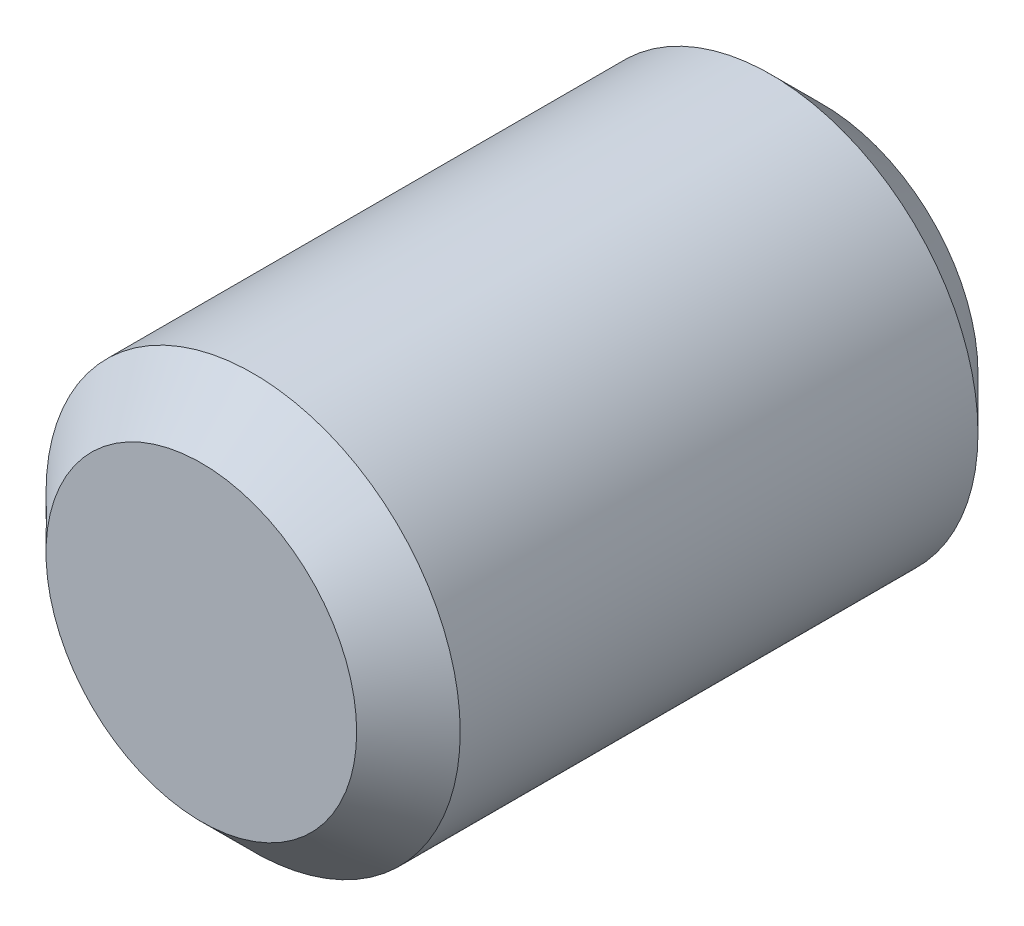
ISO-10303-21;
HEADER;
FILE_DESCRIPTION(('STEP AP214'),'2;1');
FILE_NAME('part.step','',(''),(''),'','','');
FILE_SCHEMA(('AUTOMOTIVE_DESIGN { 1 0 10303 214 1 1 1 1 }'));
ENDSEC;
DATA;
#1=APPLICATION_CONTEXT('core data for automotive mechanical design processes');
#2=APPLICATION_PROTOCOL_DEFINITION('international standard','automotive_design',2000,#1);
#3=PRODUCT_CONTEXT('',#1,'mechanical');
#4=PRODUCT('Part','Part','',(#3));
#5=PRODUCT_RELATED_PRODUCT_CATEGORY('part','',(#4));
#6=PRODUCT_DEFINITION_FORMATION('','',#4);
#7=PRODUCT_DEFINITION_CONTEXT('part definition',#1,'design');
#8=PRODUCT_DEFINITION('design','',#6,#7);
#9=PRODUCT_DEFINITION_SHAPE('','',#8);
#10=(LENGTH_UNIT() NAMED_UNIT(*) SI_UNIT(.MILLI.,.METRE.));
#11=(NAMED_UNIT(*) PLANE_ANGLE_UNIT() SI_UNIT($,.RADIAN.));
#12=(NAMED_UNIT(*) SI_UNIT($,.STERADIAN.) SOLID_ANGLE_UNIT());
#13=UNCERTAINTY_MEASURE_WITH_UNIT(LENGTH_MEASURE(1.E-05),#10,'distance_accuracy_value','');
#14=(GEOMETRIC_REPRESENTATION_CONTEXT(3) GLOBAL_UNCERTAINTY_ASSIGNED_CONTEXT((#13)) GLOBAL_UNIT_ASSIGNED_CONTEXT((#10,
#11,#12)) REPRESENTATION_CONTEXT('',''));
#15=CARTESIAN_POINT('',(0.,0.,0.));
#16=DIRECTION('',(0.,0.,1.));
#17=DIRECTION('',(1.,0.,0.));
#18=AXIS2_PLACEMENT_3D('',#15,#16,#17);
#19=CARTESIAN_POINT('',(0.,0.,6.));
#20=DIRECTION('',(0.,0.,-1.));
#21=DIRECTION('',(-1.,0.,0.));
#22=AXIS2_PLACEMENT_3D('',#19,#20,#21);
#23=CYLINDRICAL_SURFACE('',#22,4.);
#24=CARTESIAN_POINT('',(0.,0.,-5.));
#25=DIRECTION('',(0.,0.,1.));
#26=DIRECTION('',(1.,0.,0.));
#27=AXIS2_PLACEMENT_3D('',#24,#25,#26);
#28=CIRCLE('',#27,4.);
#29=CARTESIAN_POINT('',(4.,0.,-5.));
#30=VERTEX_POINT('',#29);
#31=EDGE_CURVE('E43',#30,#30,#28,.T.);
#32=ORIENTED_EDGE('',*,*,#31,.T.);
#33=EDGE_LOOP('',(#32));
#34=FACE_BOUND('',#33,.T.);
#35=CARTESIAN_POINT('',(0.,0.,5.));
#36=DIRECTION('',(0.,0.,1.));
#37=DIRECTION('',(1.,0.,0.));
#38=AXIS2_PLACEMENT_3D('',#35,#36,#37);
#39=CIRCLE('',#38,4.);
#40=CARTESIAN_POINT('',(4.,0.,5.));
#41=VERTEX_POINT('',#40);
#42=EDGE_CURVE('E47',#41,#41,#39,.F.);
#43=ORIENTED_EDGE('',*,*,#42,.T.);
#44=EDGE_LOOP('',(#43));
#45=FACE_BOUND('',#44,.T.);
#46=ADVANCED_FACE('F32',(#34,#45),#23,.T.);
#47=CARTESIAN_POINT('',(0.,0.,6.));
#48=DIRECTION('',(0.,0.,1.));
#49=DIRECTION('',(1.,0.,0.));
#50=AXIS2_PLACEMENT_3D('',#47,#48,#49);
#51=PLANE('',#50);
#52=CARTESIAN_POINT('',(0.,0.,6.));
#53=DIRECTION('',(0.,0.,1.));
#54=DIRECTION('',(1.,0.,0.));
#55=AXIS2_PLACEMENT_3D('',#52,#53,#54);
#56=CIRCLE('',#55,3.);
#57=CARTESIAN_POINT('',(3.,0.,6.));
#58=VERTEX_POINT('',#57);
#59=EDGE_CURVE('E10',#58,#58,#56,.T.);
#60=ORIENTED_EDGE('',*,*,#59,.T.);
#61=EDGE_LOOP('',(#60));
#62=FACE_BOUND('',#61,.T.);
#63=ADVANCED_FACE('F63',(#62),#51,.T.);
#64=CARTESIAN_POINT('',(0.,0.,-6.));
#65=DIRECTION('',(0.,0.,1.));
#66=DIRECTION('',(1.,0.,0.));
#67=AXIS2_PLACEMENT_3D('',#64,#65,#66);
#68=PLANE('',#67);
#69=CARTESIAN_POINT('',(0.,0.,-6.));
#70=DIRECTION('',(0.,0.,1.));
#71=DIRECTION('',(1.,0.,0.));
#72=AXIS2_PLACEMENT_3D('',#69,#70,#71);
#73=CIRCLE('',#72,2.99999999999999);
#74=CARTESIAN_POINT('',(2.99999999999999,0.,-6.));
#75=VERTEX_POINT('',#74);
#76=EDGE_CURVE('E39',#75,#75,#73,.F.);
#77=ORIENTED_EDGE('',*,*,#76,.T.);
#78=EDGE_LOOP('',(#77));
#79=FACE_BOUND('',#78,.T.);
#80=ADVANCED_FACE('F60',(#79),#68,.F.);
#81=CARTESIAN_POINT('',(0.,0.,-5.));
#82=DIRECTION('',(0.,0.,1.));
#83=DIRECTION('',(1.,0.,0.));
#84=AXIS2_PLACEMENT_3D('',#81,#82,#83);
#85=CONICAL_SURFACE('',#84,4.,0.785398163397451);
#86=ORIENTED_EDGE('',*,*,#76,.F.);
#87=EDGE_LOOP('',(#86));
#88=FACE_BOUND('',#87,.T.);
#89=ORIENTED_EDGE('',*,*,#31,.F.);
#90=EDGE_LOOP('',(#89));
#91=FACE_BOUND('',#90,.T.);
#92=ADVANCED_FACE('F56',(#88,#91),#85,.T.);
#93=CARTESIAN_POINT('',(0.,0.,6.));
#94=DIRECTION('',(0.,0.,-1.));
#95=DIRECTION('',(-1.,0.,0.));
#96=AXIS2_PLACEMENT_3D('',#93,#94,#95);
#97=CONICAL_SURFACE('',#96,3.,0.785398163397447);
#98=ORIENTED_EDGE('',*,*,#42,.F.);
#99=EDGE_LOOP('',(#98));
#100=FACE_BOUND('',#99,.T.);
#101=ORIENTED_EDGE('',*,*,#59,.F.);
#102=EDGE_LOOP('',(#101));
#103=FACE_BOUND('',#102,.T.);
#104=ADVANCED_FACE('F34',(#100,#103),#97,.T.);
#105=CLOSED_SHELL('',(#46,#63,#80,#92,#104));
#106=MANIFOLD_SOLID_BREP('B2',#105);
#107=ADVANCED_BREP_SHAPE_REPRESENTATION('',(#18,#106),#14);
#108=SHAPE_DEFINITION_REPRESENTATION(#9,#107);
ENDSEC;
END-ISO-10303-21;
